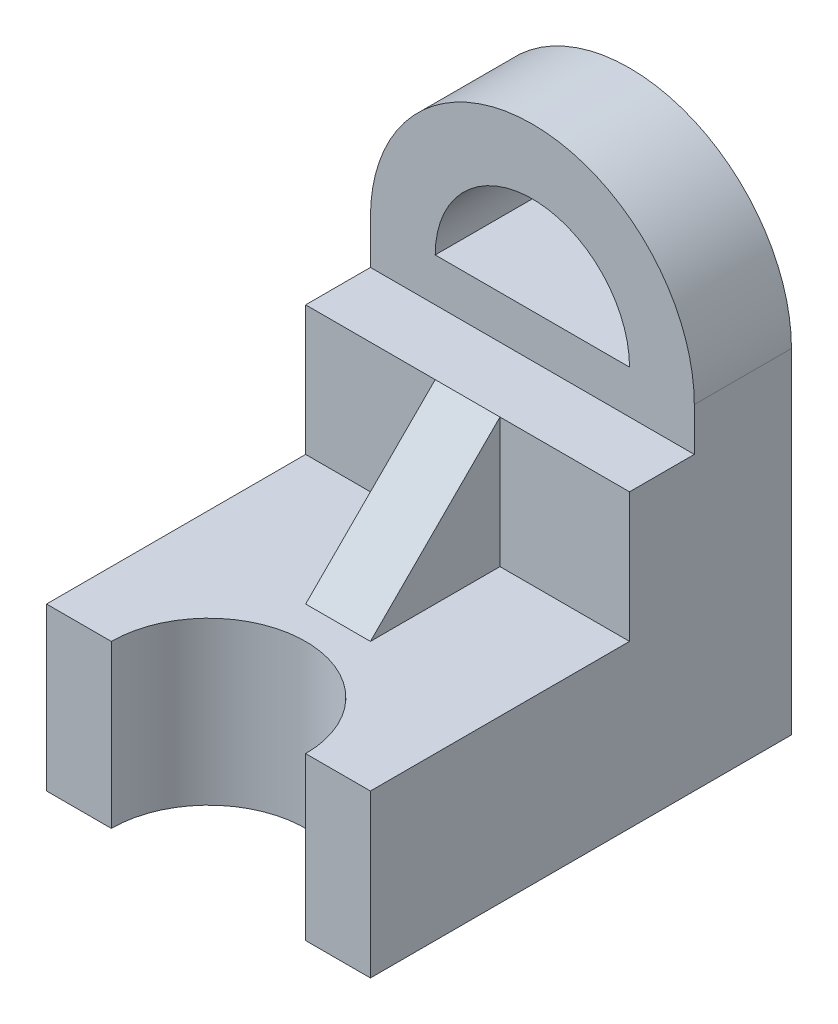
ISO-10303-21;
HEADER;
FILE_DESCRIPTION(('STEP AP214'),'2;1');
FILE_NAME('part.step','',(''),(''),'','','');
FILE_SCHEMA(('AUTOMOTIVE_DESIGN { 1 0 10303 214 1 1 1 1 }'));
ENDSEC;
DATA;
#1=APPLICATION_CONTEXT('core data for automotive mechanical design processes');
#2=APPLICATION_PROTOCOL_DEFINITION('international standard','automotive_design',2000,#1);
#3=PRODUCT_CONTEXT('',#1,'mechanical');
#4=PRODUCT('Part','Part','',(#3));
#5=PRODUCT_RELATED_PRODUCT_CATEGORY('part','',(#4));
#6=PRODUCT_DEFINITION_FORMATION('','',#4);
#7=PRODUCT_DEFINITION_CONTEXT('part definition',#1,'design');
#8=PRODUCT_DEFINITION('design','',#6,#7);
#9=PRODUCT_DEFINITION_SHAPE('','',#8);
#10=(LENGTH_UNIT() NAMED_UNIT(*) SI_UNIT(.MILLI.,.METRE.));
#11=(NAMED_UNIT(*) PLANE_ANGLE_UNIT() SI_UNIT($,.RADIAN.));
#12=(NAMED_UNIT(*) SI_UNIT($,.STERADIAN.) SOLID_ANGLE_UNIT());
#13=UNCERTAINTY_MEASURE_WITH_UNIT(LENGTH_MEASURE(1.E-05),#10,'distance_accuracy_value','');
#14=(GEOMETRIC_REPRESENTATION_CONTEXT(3) GLOBAL_UNCERTAINTY_ASSIGNED_CONTEXT((#13)) GLOBAL_UNIT_ASSIGNED_CONTEXT((#10,
#11,#12)) REPRESENTATION_CONTEXT('',''));
#15=CARTESIAN_POINT('',(0.,0.,0.));
#16=DIRECTION('',(0.,0.,1.));
#17=DIRECTION('',(1.,0.,0.));
#18=AXIS2_PLACEMENT_3D('',#15,#16,#17);
#19=CARTESIAN_POINT('',(0.,0.,117.));
#20=DIRECTION('',(0.,0.,1.));
#21=DIRECTION('',(1.,0.,0.));
#22=AXIS2_PLACEMENT_3D('',#19,#20,#21);
#23=PLANE('',#22);
#24=DIRECTION('',(0.,1.,0.));
#25=VECTOR('',#24,1.);
#26=CARTESIAN_POINT('',(27.,-0.00100000000000794,117.));
#27=LINE('',#26,#25);
#28=CARTESIAN_POINT('',(27.,45.,117.));
#29=VERTEX_POINT('',#28);
#30=CARTESIAN_POINT('',(27.,0.,117.));
#31=VERTEX_POINT('',#30);
#32=EDGE_CURVE('E166',#29,#31,#27,.F.);
#33=ORIENTED_EDGE('',*,*,#32,.T.);
#34=DIRECTION('',(1.,0.,0.));
#35=VECTOR('',#34,1.);
#36=CARTESIAN_POINT('',(0.,0.,117.));
#37=LINE('',#36,#35);
#38=CARTESIAN_POINT('',(45.,0.,117.));
#39=VERTEX_POINT('',#38);
#40=EDGE_CURVE('E174',#31,#39,#37,.T.);
#41=ORIENTED_EDGE('',*,*,#40,.T.);
#42=DIRECTION('',(0.,1.,0.));
#43=VECTOR('',#42,1.);
#44=CARTESIAN_POINT('',(45.,0.,117.));
#45=LINE('',#44,#43);
#46=CARTESIAN_POINT('',(45.,45.,117.));
#47=VERTEX_POINT('',#46);
#48=EDGE_CURVE('E181',#39,#47,#45,.T.);
#49=ORIENTED_EDGE('',*,*,#48,.T.);
#50=DIRECTION('',(1.,0.,0.));
#51=VECTOR('',#50,1.);
#52=CARTESIAN_POINT('',(0.,45.,117.));
#53=LINE('',#52,#51);
#54=EDGE_CURVE('E186',#29,#47,#53,.T.);
#55=ORIENTED_EDGE('',*,*,#54,.F.);
#56=EDGE_LOOP('',(#33,#41,#49,#55));
#57=FACE_BOUND('',#56,.T.);
#58=ADVANCED_FACE('F51',(#57),#23,.T.);
#59=CARTESIAN_POINT('',(0.,0.,45.));
#60=DIRECTION('',(0.,0.,1.));
#61=DIRECTION('',(1.,0.,0.));
#62=AXIS2_PLACEMENT_3D('',#59,#60,#61);
#63=PLANE('',#62);
#64=DIRECTION('',(1.,0.,0.));
#65=VECTOR('',#64,1.);
#66=CARTESIAN_POINT('',(0.,45.,45.));
#67=LINE('',#66,#65);
#68=CARTESIAN_POINT('',(-45.,45.,45.));
#69=VERTEX_POINT('',#68);
#70=CARTESIAN_POINT('',(-9.,45.,45.));
#71=VERTEX_POINT('',#70);
#72=EDGE_CURVE('E234',#69,#71,#67,.T.);
#73=ORIENTED_EDGE('',*,*,#72,.T.);
#74=DIRECTION('',(0.,1.,0.));
#75=VECTOR('',#74,1.);
#76=CARTESIAN_POINT('',(-9.,0.,45.));
#77=LINE('',#76,#75);
#78=CARTESIAN_POINT('',(-9.,81.,45.));
#79=VERTEX_POINT('',#78);
#80=EDGE_CURVE('E319',#71,#79,#77,.T.);
#81=ORIENTED_EDGE('',*,*,#80,.T.);
#82=DIRECTION('',(1.,0.,0.));
#83=VECTOR('',#82,1.);
#84=CARTESIAN_POINT('',(0.,81.,45.));
#85=LINE('',#84,#83);
#86=CARTESIAN_POINT('',(-45.,81.,45.));
#87=VERTEX_POINT('',#86);
#88=EDGE_CURVE('E238',#87,#79,#85,.T.);
#89=ORIENTED_EDGE('',*,*,#88,.F.);
#90=DIRECTION('',(0.,1.,0.));
#91=VECTOR('',#90,1.);
#92=CARTESIAN_POINT('',(-45.,0.,45.));
#93=LINE('',#92,#91);
#94=EDGE_CURVE('E246',#69,#87,#93,.T.);
#95=ORIENTED_EDGE('',*,*,#94,.F.);
#96=EDGE_LOOP('',(#73,#81,#89,#95));
#97=FACE_BOUND('',#96,.T.);
#98=ADVANCED_FACE('F317',(#97),#63,.T.);
#99=CARTESIAN_POINT('',(0.,0.,117.));
#100=DIRECTION('',(0.,1.,0.));
#101=DIRECTION('',(0.,0.,1.));
#102=AXIS2_PLACEMENT_3D('',#99,#100,#101);
#103=PLANE('',#102);
#104=ORIENTED_EDGE('',*,*,#40,.F.);
#105=CARTESIAN_POINT('',(0.,0.,117.));
#106=DIRECTION('',(0.,1.,0.));
#107=DIRECTION('',(0.,0.,1.));
#108=AXIS2_PLACEMENT_3D('',#105,#106,#107);
#109=CIRCLE('',#108,27.);
#110=CARTESIAN_POINT('',(-27.,0.,117.));
#111=VERTEX_POINT('',#110);
#112=EDGE_CURVE('E159',#111,#31,#109,.F.);
#113=ORIENTED_EDGE('',*,*,#112,.F.);
#114=CARTESIAN_POINT('',(-45.,0.,117.));
#115=VERTEX_POINT('',#114);
#116=EDGE_CURVE('E171',#115,#111,#37,.T.);
#117=ORIENTED_EDGE('',*,*,#116,.F.);
#118=DIRECTION('',(0.,0.,-1.));
#119=VECTOR('',#118,1.);
#120=CARTESIAN_POINT('',(-45.,0.,117.));
#121=LINE('',#120,#119);
#122=CARTESIAN_POINT('',(-45.,0.,0.));
#123=VERTEX_POINT('',#122);
#124=EDGE_CURVE('E198',#115,#123,#121,.T.);
#125=ORIENTED_EDGE('',*,*,#124,.T.);
#126=DIRECTION('',(1.,0.,0.));
#127=VECTOR('',#126,1.);
#128=CARTESIAN_POINT('',(0.,0.,0.));
#129=LINE('',#128,#127);
#130=CARTESIAN_POINT('',(45.,0.,0.));
#131=VERTEX_POINT('',#130);
#132=EDGE_CURVE('E199',#123,#131,#129,.T.);
#133=ORIENTED_EDGE('',*,*,#132,.T.);
#134=DIRECTION('',(0.,0.,-1.));
#135=VECTOR('',#134,1.);
#136=CARTESIAN_POINT('',(45.,0.,117.));
#137=LINE('',#136,#135);
#138=EDGE_CURVE('E11',#39,#131,#137,.T.);
#139=ORIENTED_EDGE('',*,*,#138,.F.);
#140=EDGE_LOOP('',(#104,#113,#117,#125,#133,#139));
#141=FACE_BOUND('',#140,.T.);
#142=ADVANCED_FACE('F53',(#141),#103,.F.);
#143=CARTESIAN_POINT('',(45.,0.,117.));
#144=DIRECTION('',(-1.,0.,0.));
#145=DIRECTION('',(0.,0.,1.));
#146=AXIS2_PLACEMENT_3D('',#143,#144,#145);
#147=PLANE('',#146);
#148=DIRECTION('',(0.,1.,0.));
#149=VECTOR('',#148,1.);
#150=CARTESIAN_POINT('',(45.,0.,0.));
#151=LINE('',#150,#149);
#152=CARTESIAN_POINT('',(45.,93.,0.));
#153=VERTEX_POINT('',#152);
#154=EDGE_CURVE('E202',#131,#153,#151,.T.);
#155=ORIENTED_EDGE('',*,*,#154,.T.);
#156=DIRECTION('',(0.,0.,-1.));
#157=VECTOR('',#156,1.);
#158=CARTESIAN_POINT('',(45.,93.,27.));
#159=LINE('',#158,#157);
#160=CARTESIAN_POINT('',(45.,93.,27.));
#161=VERTEX_POINT('',#160);
#162=EDGE_CURVE('E263',#161,#153,#159,.T.);
#163=ORIENTED_EDGE('',*,*,#162,.F.);
#164=DIRECTION('',(0.,-1.,0.));
#165=VECTOR('',#164,1.);
#166=CARTESIAN_POINT('',(45.,0.,27.));
#167=LINE('',#166,#165);
#168=CARTESIAN_POINT('',(45.,81.,27.));
#169=VERTEX_POINT('',#168);
#170=EDGE_CURVE('E261',#161,#169,#167,.T.);
#171=ORIENTED_EDGE('',*,*,#170,.T.);
#172=DIRECTION('',(0.,0.,-1.));
#173=VECTOR('',#172,1.);
#174=CARTESIAN_POINT('',(45.,81.,45.));
#175=LINE('',#174,#173);
#176=CARTESIAN_POINT('',(45.,81.,45.));
#177=VERTEX_POINT('',#176);
#178=EDGE_CURVE('E190',#177,#169,#175,.T.);
#179=ORIENTED_EDGE('',*,*,#178,.F.);
#180=DIRECTION('',(0.,1.,0.));
#181=VECTOR('',#180,1.);
#182=CARTESIAN_POINT('',(45.,0.,45.));
#183=LINE('',#182,#181);
#184=CARTESIAN_POINT('',(45.,45.,45.));
#185=VERTEX_POINT('',#184);
#186=EDGE_CURVE('E226',#185,#177,#183,.T.);
#187=ORIENTED_EDGE('',*,*,#186,.F.);
#188=DIRECTION('',(0.,0.,-1.));
#189=VECTOR('',#188,1.);
#190=CARTESIAN_POINT('',(45.,45.,117.));
#191=LINE('',#190,#189);
#192=EDGE_CURVE('E60',#47,#185,#191,.T.);
#193=ORIENTED_EDGE('',*,*,#192,.F.);
#194=ORIENTED_EDGE('',*,*,#48,.F.);
#195=ORIENTED_EDGE('',*,*,#138,.T.);
#196=EDGE_LOOP('',(#155,#163,#171,#179,#187,#193,#194,#195));
#197=FACE_BOUND('',#196,.T.);
#198=ADVANCED_FACE('F227',(#197),#147,.F.);
#199=CARTESIAN_POINT('',(0.,45.,117.));
#200=DIRECTION('',(0.,1.,0.));
#201=DIRECTION('',(0.,0.,1.));
#202=AXIS2_PLACEMENT_3D('',#199,#200,#201);
#203=PLANE('',#202);
#204=CARTESIAN_POINT('',(0.,45.,117.));
#205=DIRECTION('',(0.,1.,0.));
#206=DIRECTION('',(0.,0.,1.));
#207=AXIS2_PLACEMENT_3D('',#204,#205,#206);
#208=CIRCLE('',#207,27.);
#209=CARTESIAN_POINT('',(-27.,45.,117.));
#210=VERTEX_POINT('',#209);
#211=EDGE_CURVE('E67',#29,#210,#208,.T.);
#212=ORIENTED_EDGE('',*,*,#211,.F.);
#213=ORIENTED_EDGE('',*,*,#54,.T.);
#214=ORIENTED_EDGE('',*,*,#192,.T.);
#215=CARTESIAN_POINT('',(9.,45.,45.));
#216=VERTEX_POINT('',#215);
#217=EDGE_CURVE('E220',#216,#185,#67,.T.);
#218=ORIENTED_EDGE('',*,*,#217,.F.);
#219=DIRECTION('',(0.,0.,-1.));
#220=VECTOR('',#219,1.);
#221=CARTESIAN_POINT('',(9.,45.,117.));
#222=LINE('',#221,#220);
#223=CARTESIAN_POINT('',(9.,45.,81.));
#224=VERTEX_POINT('',#223);
#225=EDGE_CURVE('E324',#224,#216,#222,.T.);
#226=ORIENTED_EDGE('',*,*,#225,.F.);
#227=DIRECTION('',(1.,0.,0.));
#228=VECTOR('',#227,1.);
#229=CARTESIAN_POINT('',(0.,45.,81.));
#230=LINE('',#229,#228);
#231=CARTESIAN_POINT('',(-9.,45.,81.));
#232=VERTEX_POINT('',#231);
#233=EDGE_CURVE('E286',#232,#224,#230,.T.);
#234=ORIENTED_EDGE('',*,*,#233,.F.);
#235=DIRECTION('',(0.,0.,-1.));
#236=VECTOR('',#235,1.);
#237=CARTESIAN_POINT('',(-9.,45.,117.));
#238=LINE('',#237,#236);
#239=EDGE_CURVE('E574',#232,#71,#238,.T.);
#240=ORIENTED_EDGE('',*,*,#239,.T.);
#241=ORIENTED_EDGE('',*,*,#72,.F.);
#242=DIRECTION('',(0.,0.,-1.));
#243=VECTOR('',#242,1.);
#244=CARTESIAN_POINT('',(-45.,45.,117.));
#245=LINE('',#244,#243);
#246=CARTESIAN_POINT('',(-45.,45.,117.));
#247=VERTEX_POINT('',#246);
#248=EDGE_CURVE('E209',#247,#69,#245,.T.);
#249=ORIENTED_EDGE('',*,*,#248,.F.);
#250=EDGE_CURVE('E193',#247,#210,#53,.T.);
#251=ORIENTED_EDGE('',*,*,#250,.T.);
#252=EDGE_LOOP('',(#212,#213,#214,#218,#226,#234,#240,#241,#249,#251));
#253=FACE_BOUND('',#252,.T.);
#254=ADVANCED_FACE('F218',(#253),#203,.T.);
#255=CARTESIAN_POINT('',(-45.,0.,117.));
#256=DIRECTION('',(-1.,0.,0.));
#257=DIRECTION('',(0.,0.,1.));
#258=AXIS2_PLACEMENT_3D('',#255,#256,#257);
#259=PLANE('',#258);
#260=DIRECTION('',(0.,1.,0.));
#261=VECTOR('',#260,1.);
#262=CARTESIAN_POINT('',(-45.,0.,0.));
#263=LINE('',#262,#261);
#264=CARTESIAN_POINT('',(-45.,93.,0.));
#265=VERTEX_POINT('',#264);
#266=EDGE_CURVE('E188',#123,#265,#263,.T.);
#267=ORIENTED_EDGE('',*,*,#266,.F.);
#268=ORIENTED_EDGE('',*,*,#124,.F.);
#269=DIRECTION('',(0.,1.,0.));
#270=VECTOR('',#269,1.);
#271=CARTESIAN_POINT('',(-45.,0.,117.));
#272=LINE('',#271,#270);
#273=EDGE_CURVE('E179',#115,#247,#272,.T.);
#274=ORIENTED_EDGE('',*,*,#273,.T.);
#275=ORIENTED_EDGE('',*,*,#248,.T.);
#276=ORIENTED_EDGE('',*,*,#94,.T.);
#277=DIRECTION('',(0.,0.,-1.));
#278=VECTOR('',#277,1.);
#279=CARTESIAN_POINT('',(-45.,81.,45.));
#280=LINE('',#279,#278);
#281=CARTESIAN_POINT('',(-45.,81.,27.));
#282=VERTEX_POINT('',#281);
#283=EDGE_CURVE('E249',#87,#282,#280,.T.);
#284=ORIENTED_EDGE('',*,*,#283,.T.);
#285=DIRECTION('',(0.,1.,0.));
#286=VECTOR('',#285,1.);
#287=CARTESIAN_POINT('',(-45.,0.,27.));
#288=LINE('',#287,#286);
#289=CARTESIAN_POINT('',(-45.,93.,27.));
#290=VERTEX_POINT('',#289);
#291=EDGE_CURVE('E274',#282,#290,#288,.T.);
#292=ORIENTED_EDGE('',*,*,#291,.T.);
#293=DIRECTION('',(0.,0.,-1.));
#294=VECTOR('',#293,1.);
#295=CARTESIAN_POINT('',(-45.,93.,27.));
#296=LINE('',#295,#294);
#297=EDGE_CURVE('E299',#290,#265,#296,.T.);
#298=ORIENTED_EDGE('',*,*,#297,.T.);
#299=EDGE_LOOP('',(#267,#268,#274,#275,#276,#284,#292,#298));
#300=FACE_BOUND('',#299,.T.);
#301=ADVANCED_FACE('F307',(#300),#259,.T.);
#302=DIRECTION('',(0.,1.,0.));
#303=VECTOR('',#302,1.);
#304=CARTESIAN_POINT('',(-27.,-0.00100000000000794,117.));
#305=LINE('',#304,#303);
#306=EDGE_CURVE('E156',#111,#210,#305,.T.);
#307=ORIENTED_EDGE('',*,*,#306,.T.);
#308=ORIENTED_EDGE('',*,*,#250,.F.);
#309=ORIENTED_EDGE('',*,*,#273,.F.);
#310=ORIENTED_EDGE('',*,*,#116,.T.);
#311=EDGE_LOOP('',(#307,#308,#309,#310));
#312=FACE_BOUND('',#311,.T.);
#313=ADVANCED_FACE('F177',(#312),#23,.T.);
#314=CARTESIAN_POINT('',(0.,0.,0.));
#315=DIRECTION('',(0.,0.,1.));
#316=DIRECTION('',(1.,0.,0.));
#317=AXIS2_PLACEMENT_3D('',#314,#315,#316);
#318=PLANE('',#317);
#319=DIRECTION('',(1.,0.,0.));
#320=VECTOR('',#319,1.);
#321=CARTESIAN_POINT('',(0.,93.,0.));
#322=LINE('',#321,#320);
#323=CARTESIAN_POINT('',(-27.,93.,0.));
#324=VERTEX_POINT('',#323);
#325=CARTESIAN_POINT('',(27.,93.,0.));
#326=VERTEX_POINT('',#325);
#327=EDGE_CURVE('E285',#324,#326,#322,.T.);
#328=ORIENTED_EDGE('',*,*,#327,.T.);
#329=CARTESIAN_POINT('',(0.,93.,0.));
#330=DIRECTION('',(0.,0.,1.));
#331=DIRECTION('',(1.,0.,0.));
#332=AXIS2_PLACEMENT_3D('',#329,#330,#331);
#333=CIRCLE('',#332,27.);
#334=EDGE_CURVE('E289',#324,#326,#333,.F.);
#335=ORIENTED_EDGE('',*,*,#334,.F.);
#336=EDGE_LOOP('',(#328,#335));
#337=FACE_BOUND('',#336,.T.);
#338=ORIENTED_EDGE('',*,*,#154,.F.);
#339=ORIENTED_EDGE('',*,*,#132,.F.);
#340=ORIENTED_EDGE('',*,*,#266,.T.);
#341=CARTESIAN_POINT('',(0.,93.,0.));
#342=DIRECTION('',(0.,0.,1.));
#343=DIRECTION('',(1.,0.,0.));
#344=AXIS2_PLACEMENT_3D('',#341,#342,#343);
#345=CIRCLE('',#344,45.);
#346=EDGE_CURVE('E281',#265,#153,#345,.F.);
#347=ORIENTED_EDGE('',*,*,#346,.T.);
#348=EDGE_LOOP('',(#338,#339,#340,#347));
#349=FACE_BOUND('',#348,.T.);
#350=ADVANCED_FACE('F312',(#337,#349),#318,.F.);
#351=CARTESIAN_POINT('',(0.,81.,45.));
#352=DIRECTION('',(0.,1.,0.));
#353=DIRECTION('',(0.,0.,1.));
#354=AXIS2_PLACEMENT_3D('',#351,#352,#353);
#355=PLANE('',#354);
#356=ORIENTED_EDGE('',*,*,#178,.T.);
#357=DIRECTION('',(1.,0.,0.));
#358=VECTOR('',#357,1.);
#359=CARTESIAN_POINT('',(0.,81.,27.));
#360=LINE('',#359,#358);
#361=EDGE_CURVE('E258',#282,#169,#360,.T.);
#362=ORIENTED_EDGE('',*,*,#361,.F.);
#363=ORIENTED_EDGE('',*,*,#283,.F.);
#364=ORIENTED_EDGE('',*,*,#88,.T.);
#365=DIRECTION('',(-1.,0.,0.));
#366=VECTOR('',#365,1.);
#367=CARTESIAN_POINT('',(0.,81.,45.));
#368=LINE('',#367,#366);
#369=CARTESIAN_POINT('',(9.,81.,45.));
#370=VERTEX_POINT('',#369);
#371=EDGE_CURVE('E320',#370,#79,#368,.T.);
#372=ORIENTED_EDGE('',*,*,#371,.F.);
#373=EDGE_CURVE('E233',#370,#177,#85,.T.);
#374=ORIENTED_EDGE('',*,*,#373,.T.);
#375=EDGE_LOOP('',(#356,#362,#363,#364,#372,#374));
#376=FACE_BOUND('',#375,.T.);
#377=ADVANCED_FACE('F257',(#376),#355,.T.);
#378=DIRECTION('',(0.,1.,0.));
#379=VECTOR('',#378,1.);
#380=CARTESIAN_POINT('',(9.,0.,45.));
#381=LINE('',#380,#379);
#382=EDGE_CURVE('E329',#216,#370,#381,.T.);
#383=ORIENTED_EDGE('',*,*,#382,.F.);
#384=ORIENTED_EDGE('',*,*,#217,.T.);
#385=ORIENTED_EDGE('',*,*,#186,.T.);
#386=ORIENTED_EDGE('',*,*,#373,.F.);
#387=EDGE_LOOP('',(#383,#384,#385,#386));
#388=FACE_BOUND('',#387,.T.);
#389=ADVANCED_FACE('F357',(#388),#63,.T.);
#390=CARTESIAN_POINT('',(0.,93.,27.));
#391=DIRECTION('',(0.,1.,0.));
#392=DIRECTION('',(-1.,0.,0.));
#393=AXIS2_PLACEMENT_3D('',#390,#391,#392);
#394=PLANE('',#393);
#395=DIRECTION('',(0.,0.,-1.));
#396=VECTOR('',#395,1.);
#397=CARTESIAN_POINT('',(27.,93.,27.));
#398=LINE('',#397,#396);
#399=CARTESIAN_POINT('',(27.,93.,27.));
#400=VERTEX_POINT('',#399);
#401=EDGE_CURVE('E294',#400,#326,#398,.T.);
#402=ORIENTED_EDGE('',*,*,#401,.T.);
#403=ORIENTED_EDGE('',*,*,#327,.F.);
#404=DIRECTION('',(0.,0.,-1.));
#405=VECTOR('',#404,1.);
#406=CARTESIAN_POINT('',(-27.,93.,27.));
#407=LINE('',#406,#405);
#408=CARTESIAN_POINT('',(-27.,93.,27.));
#409=VERTEX_POINT('',#408);
#410=EDGE_CURVE('E298',#409,#324,#407,.T.);
#411=ORIENTED_EDGE('',*,*,#410,.F.);
#412=DIRECTION('',(1.,0.,0.));
#413=VECTOR('',#412,1.);
#414=CARTESIAN_POINT('',(0.,93.,27.));
#415=LINE('',#414,#413);
#416=EDGE_CURVE('E268',#409,#400,#415,.T.);
#417=ORIENTED_EDGE('',*,*,#416,.T.);
#418=EDGE_LOOP('',(#402,#403,#411,#417));
#419=FACE_BOUND('',#418,.T.);
#420=ADVANCED_FACE('F417',(#419),#394,.T.);
#421=CARTESIAN_POINT('',(0.,93.,27.));
#422=DIRECTION('',(0.,0.,-1.));
#423=DIRECTION('',(-1.,0.,0.));
#424=AXIS2_PLACEMENT_3D('',#421,#422,#423);
#425=CYLINDRICAL_SURFACE('',#424,45.);
#426=ORIENTED_EDGE('',*,*,#346,.F.);
#427=ORIENTED_EDGE('',*,*,#297,.F.);
#428=CARTESIAN_POINT('',(0.,93.,27.));
#429=DIRECTION('',(0.,0.,1.));
#430=DIRECTION('',(1.,0.,0.));
#431=AXIS2_PLACEMENT_3D('',#428,#429,#430);
#432=CIRCLE('',#431,45.);
#433=EDGE_CURVE('E293',#290,#161,#432,.F.);
#434=ORIENTED_EDGE('',*,*,#433,.T.);
#435=ORIENTED_EDGE('',*,*,#162,.T.);
#436=EDGE_LOOP('',(#426,#427,#434,#435));
#437=FACE_BOUND('',#436,.T.);
#438=ADVANCED_FACE('F309',(#437),#425,.T.);
#439=CARTESIAN_POINT('',(0.,93.,27.));
#440=DIRECTION('',(0.,0.,-1.));
#441=DIRECTION('',(-1.,0.,0.));
#442=AXIS2_PLACEMENT_3D('',#439,#440,#441);
#443=CYLINDRICAL_SURFACE('',#442,27.);
#444=ORIENTED_EDGE('',*,*,#334,.T.);
#445=ORIENTED_EDGE('',*,*,#401,.F.);
#446=CARTESIAN_POINT('',(0.,93.,27.));
#447=DIRECTION('',(0.,0.,1.));
#448=DIRECTION('',(1.,0.,0.));
#449=AXIS2_PLACEMENT_3D('',#446,#447,#448);
#450=CIRCLE('',#449,27.);
#451=EDGE_CURVE('E272',#409,#400,#450,.F.);
#452=ORIENTED_EDGE('',*,*,#451,.F.);
#453=ORIENTED_EDGE('',*,*,#410,.T.);
#454=EDGE_LOOP('',(#444,#445,#452,#453));
#455=FACE_BOUND('',#454,.T.);
#456=ADVANCED_FACE('F338',(#455),#443,.F.);
#457=CARTESIAN_POINT('',(0.,0.,27.));
#458=DIRECTION('',(0.,0.,1.));
#459=DIRECTION('',(1.,0.,0.));
#460=AXIS2_PLACEMENT_3D('',#457,#458,#459);
#461=PLANE('',#460);
#462=ORIENTED_EDGE('',*,*,#451,.T.);
#463=ORIENTED_EDGE('',*,*,#416,.F.);
#464=EDGE_LOOP('',(#462,#463));
#465=FACE_BOUND('',#464,.T.);
#466=ORIENTED_EDGE('',*,*,#361,.T.);
#467=ORIENTED_EDGE('',*,*,#170,.F.);
#468=ORIENTED_EDGE('',*,*,#433,.F.);
#469=ORIENTED_EDGE('',*,*,#291,.F.);
#470=EDGE_LOOP('',(#466,#467,#468,#469));
#471=FACE_BOUND('',#470,.T.);
#472=ADVANCED_FACE('F335',(#465,#471),#461,.T.);
#473=CARTESIAN_POINT('',(0.,81.,45.));
#474=DIRECTION('',(0.,0.707106781186547,0.707106781186548));
#475=DIRECTION('',(0.,-0.707106781186548,0.707106781186547));
#476=AXIS2_PLACEMENT_3D('',#473,#474,#475);
#477=PLANE('',#476);
#478=DIRECTION('',(0.,-0.707106781186548,0.707106781186547));
#479=VECTOR('',#478,1.);
#480=CARTESIAN_POINT('',(-9.,81.,45.));
#481=LINE('',#480,#479);
#482=EDGE_CURVE('E75',#79,#232,#481,.T.);
#483=ORIENTED_EDGE('',*,*,#482,.T.);
#484=ORIENTED_EDGE('',*,*,#233,.T.);
#485=DIRECTION('',(0.,-0.707106781186548,0.707106781186547));
#486=VECTOR('',#485,1.);
#487=CARTESIAN_POINT('',(9.,81.,45.));
#488=LINE('',#487,#486);
#489=EDGE_CURVE('E581',#370,#224,#488,.T.);
#490=ORIENTED_EDGE('',*,*,#489,.F.);
#491=ORIENTED_EDGE('',*,*,#371,.T.);
#492=EDGE_LOOP('',(#483,#484,#490,#491));
#493=FACE_BOUND('',#492,.T.);
#494=ADVANCED_FACE('F337',(#493),#477,.T.);
#495=CARTESIAN_POINT('',(9.,69.,58.5));
#496=DIRECTION('',(1.,0.,0.));
#497=DIRECTION('',(0.,0.,-1.));
#498=AXIS2_PLACEMENT_3D('',#495,#496,#497);
#499=PLANE('',#498);
#500=ORIENTED_EDGE('',*,*,#489,.T.);
#501=ORIENTED_EDGE('',*,*,#225,.T.);
#502=ORIENTED_EDGE('',*,*,#382,.T.);
#503=EDGE_LOOP('',(#500,#501,#502));
#504=FACE_BOUND('',#503,.T.);
#505=ADVANCED_FACE('F345',(#504),#499,.T.);
#506=CARTESIAN_POINT('',(-9.,69.,58.5));
#507=DIRECTION('',(1.,0.,0.));
#508=DIRECTION('',(0.,0.,-1.));
#509=AXIS2_PLACEMENT_3D('',#506,#507,#508);
#510=PLANE('',#509);
#511=ORIENTED_EDGE('',*,*,#239,.F.);
#512=ORIENTED_EDGE('',*,*,#482,.F.);
#513=ORIENTED_EDGE('',*,*,#80,.F.);
#514=EDGE_LOOP('',(#511,#512,#513));
#515=FACE_BOUND('',#514,.T.);
#516=ADVANCED_FACE('F458',(#515),#510,.F.);
#517=CARTESIAN_POINT('',(0.,-0.00100000000000794,117.));
#518=DIRECTION('',(0.,1.,0.));
#519=DIRECTION('',(0.,0.,1.));
#520=AXIS2_PLACEMENT_3D('',#517,#518,#519);
#521=CYLINDRICAL_SURFACE('',#520,27.);
#522=ORIENTED_EDGE('',*,*,#211,.T.);
#523=ORIENTED_EDGE('',*,*,#306,.F.);
#524=ORIENTED_EDGE('',*,*,#112,.T.);
#525=ORIENTED_EDGE('',*,*,#32,.F.);
#526=EDGE_LOOP('',(#522,#523,#524,#525));
#527=FACE_BOUND('',#526,.T.);
#528=ADVANCED_FACE('F158',(#527),#521,.F.);
#529=CLOSED_SHELL('',(#58,#98,#142,#198,#254,#301,#313,#350,#377,#389,#420,#438,#456,#472,#494,
#505,#516,#528));
#530=MANIFOLD_SOLID_BREP('B2',#529);
#531=ADVANCED_BREP_SHAPE_REPRESENTATION('',(#18,#530),#14);
#532=SHAPE_DEFINITION_REPRESENTATION(#9,#531);
ENDSEC;
END-ISO-10303-21;
